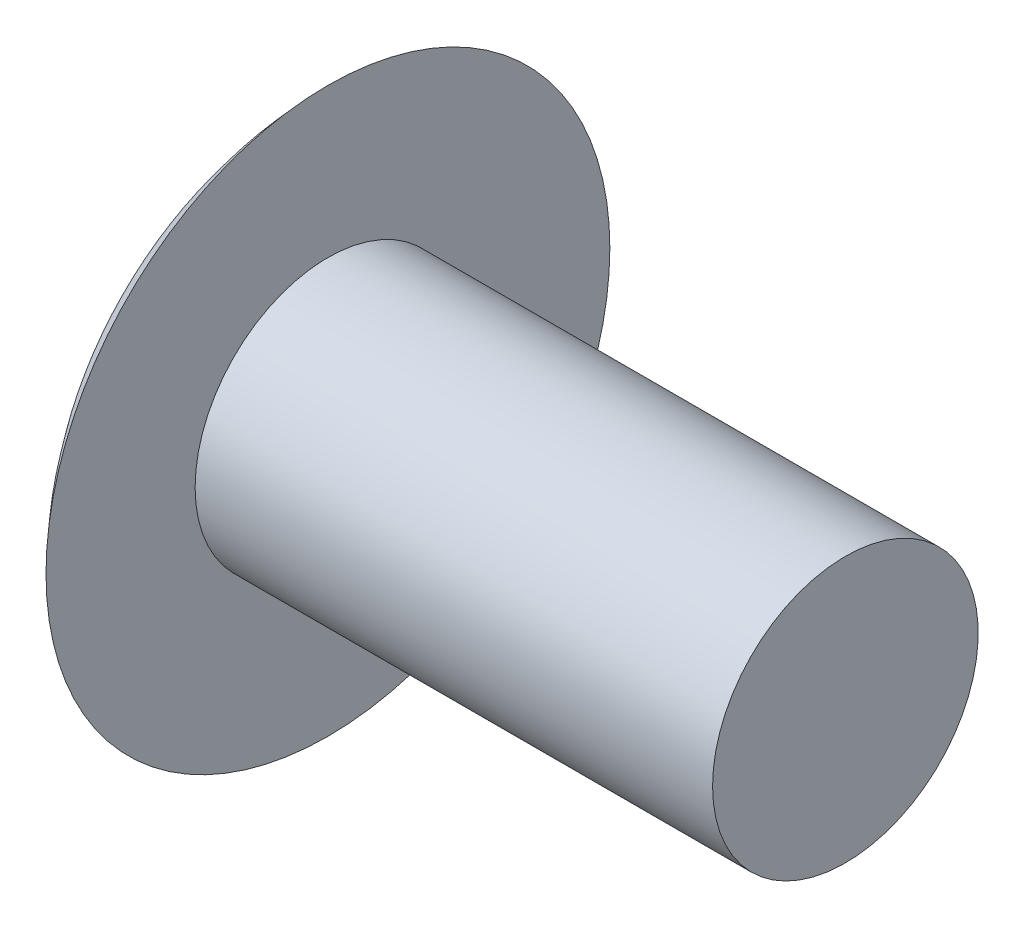
ISO-10303-21;
HEADER;
FILE_DESCRIPTION(('STEP AP214'),'2;1');
FILE_NAME('part.step','',(''),(''),'','','');
FILE_SCHEMA(('AUTOMOTIVE_DESIGN { 1 0 10303 214 1 1 1 1 }'));
ENDSEC;
DATA;
#1=APPLICATION_CONTEXT('core data for automotive mechanical design processes');
#2=APPLICATION_PROTOCOL_DEFINITION('international standard','automotive_design',2000,#1);
#3=PRODUCT_CONTEXT('',#1,'mechanical');
#4=PRODUCT('Part','Part','',(#3));
#5=PRODUCT_RELATED_PRODUCT_CATEGORY('part','',(#4));
#6=PRODUCT_DEFINITION_FORMATION('','',#4);
#7=PRODUCT_DEFINITION_CONTEXT('part definition',#1,'design');
#8=PRODUCT_DEFINITION('design','',#6,#7);
#9=PRODUCT_DEFINITION_SHAPE('','',#8);
#10=(LENGTH_UNIT() NAMED_UNIT(*) SI_UNIT(.MILLI.,.METRE.));
#11=(NAMED_UNIT(*) PLANE_ANGLE_UNIT() SI_UNIT($,.RADIAN.));
#12=(NAMED_UNIT(*) SI_UNIT($,.STERADIAN.) SOLID_ANGLE_UNIT());
#13=UNCERTAINTY_MEASURE_WITH_UNIT(LENGTH_MEASURE(1.E-05),#10,'distance_accuracy_value','');
#14=(GEOMETRIC_REPRESENTATION_CONTEXT(3) GLOBAL_UNCERTAINTY_ASSIGNED_CONTEXT((#13)) GLOBAL_UNIT_ASSIGNED_CONTEXT((#10,
#11,#12)) REPRESENTATION_CONTEXT('',''));
#15=CARTESIAN_POINT('',(0.,0.,0.));
#16=DIRECTION('',(0.,0.,1.));
#17=DIRECTION('',(1.,0.,0.));
#18=AXIS2_PLACEMENT_3D('',#15,#16,#17);
#19=CARTESIAN_POINT('',(28.4600489971164,0.,0.));
#20=DIRECTION('',(-1.,0.,0.));
#21=DIRECTION('',(0.,0.,-1.));
#22=AXIS2_PLACEMENT_3D('',#19,#20,#21);
#23=SPHERICAL_SURFACE('',#22,4.7600489971164);
#24=CARTESIAN_POINT('',(25.,0.,0.));
#25=DIRECTION('',(-1.,0.,0.));
#26=DIRECTION('',(0.,0.,1.));
#27=AXIS2_PLACEMENT_3D('',#24,#25,#26);
#28=CIRCLE('',#27,3.26896426907708);
#29=CARTESIAN_POINT('',(25.,0.,3.26896426907708));
#30=VERTEX_POINT('',#29);
#31=EDGE_CURVE('E11',#30,#30,#28,.T.);
#32=ORIENTED_EDGE('',*,*,#31,.T.);
#33=EDGE_LOOP('',(#32));
#34=FACE_BOUND('',#33,.T.);
#35=ADVANCED_FACE('F32',(#34),#23,.T.);
#36=CARTESIAN_POINT('',(25.,0.,3.26896426907708));
#37=DIRECTION('',(1.,0.,0.));
#38=DIRECTION('',(0.,0.,-1.));
#39=AXIS2_PLACEMENT_3D('',#36,#37,#38);
#40=PLANE('',#39);
#41=CARTESIAN_POINT('',(25.,0.,0.));
#42=DIRECTION('',(-1.,0.,0.));
#43=DIRECTION('',(0.,0.,1.));
#44=AXIS2_PLACEMENT_3D('',#41,#42,#43);
#45=CIRCLE('',#44,1.54);
#46=CARTESIAN_POINT('',(25.,0.,1.54));
#47=VERTEX_POINT('',#46);
#48=EDGE_CURVE('E38',#47,#47,#45,.T.);
#49=ORIENTED_EDGE('',*,*,#48,.T.);
#50=EDGE_LOOP('',(#49));
#51=FACE_BOUND('',#50,.T.);
#52=ORIENTED_EDGE('',*,*,#31,.F.);
#53=EDGE_LOOP('',(#52));
#54=FACE_BOUND('',#53,.T.);
#55=ADVANCED_FACE('F58',(#51,#54),#40,.T.);
#56=CARTESIAN_POINT('',(0.,0.,0.));
#57=DIRECTION('',(-1.,0.,0.));
#58=DIRECTION('',(0.,0.,1.));
#59=AXIS2_PLACEMENT_3D('',#56,#57,#58);
#60=CYLINDRICAL_SURFACE('',#59,1.54);
#61=CARTESIAN_POINT('',(31.,0.,0.));
#62=DIRECTION('',(-1.,0.,0.));
#63=DIRECTION('',(0.,0.,1.));
#64=AXIS2_PLACEMENT_3D('',#61,#62,#63);
#65=CIRCLE('',#64,1.54);
#66=CARTESIAN_POINT('',(31.,0.,1.54));
#67=VERTEX_POINT('',#66);
#68=EDGE_CURVE('E42',#67,#67,#65,.T.);
#69=ORIENTED_EDGE('',*,*,#68,.T.);
#70=EDGE_LOOP('',(#69));
#71=FACE_BOUND('',#70,.T.);
#72=ORIENTED_EDGE('',*,*,#48,.F.);
#73=EDGE_LOOP('',(#72));
#74=FACE_BOUND('',#73,.T.);
#75=ADVANCED_FACE('F49',(#71,#74),#60,.T.);
#76=CARTESIAN_POINT('',(31.,0.,1.54));
#77=DIRECTION('',(1.,0.,0.));
#78=DIRECTION('',(0.,0.,-1.));
#79=AXIS2_PLACEMENT_3D('',#76,#77,#78);
#80=PLANE('',#79);
#81=ORIENTED_EDGE('',*,*,#68,.F.);
#82=EDGE_LOOP('',(#81));
#83=FACE_BOUND('',#82,.T.);
#84=ADVANCED_FACE('F52',(#83),#80,.T.);
#85=CLOSED_SHELL('',(#35,#55,#75,#84));
#86=MANIFOLD_SOLID_BREP('B2',#85);
#87=ADVANCED_BREP_SHAPE_REPRESENTATION('',(#18,#86),#14);
#88=SHAPE_DEFINITION_REPRESENTATION(#9,#87);
ENDSEC;
END-ISO-10303-21;
